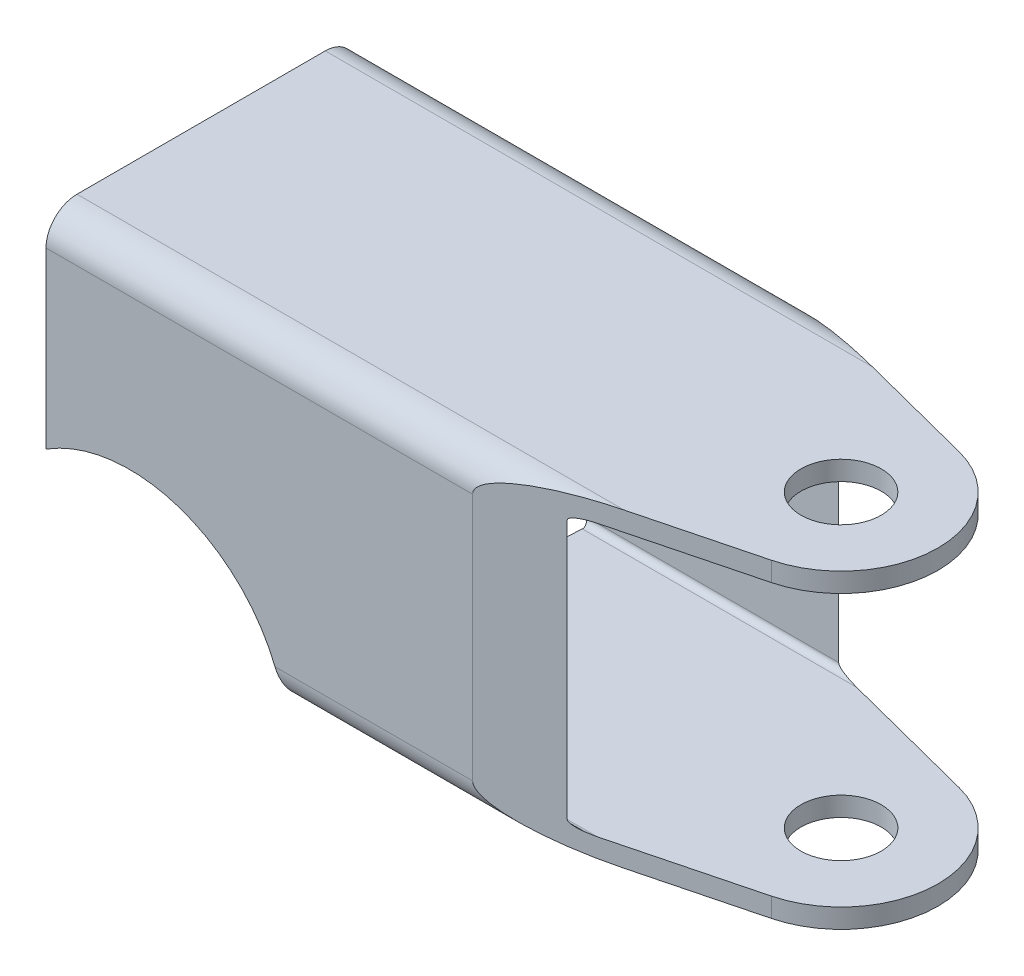
ISO-10303-21;
HEADER;
FILE_DESCRIPTION(('STEP AP214'),'2;1');
FILE_NAME('part.step','',(''),(''),'','','');
FILE_SCHEMA(('AUTOMOTIVE_DESIGN { 1 0 10303 214 1 1 1 1 }'));
ENDSEC;
DATA;
#1=APPLICATION_CONTEXT('core data for automotive mechanical design processes');
#2=APPLICATION_PROTOCOL_DEFINITION('international standard','automotive_design',2000,#1);
#3=PRODUCT_CONTEXT('',#1,'mechanical');
#4=PRODUCT('Part','Part','',(#3));
#5=PRODUCT_RELATED_PRODUCT_CATEGORY('part','',(#4));
#6=PRODUCT_DEFINITION_FORMATION('','',#4);
#7=PRODUCT_DEFINITION_CONTEXT('part definition',#1,'design');
#8=PRODUCT_DEFINITION('design','',#6,#7);
#9=PRODUCT_DEFINITION_SHAPE('','',#8);
#10=(LENGTH_UNIT() NAMED_UNIT(*) SI_UNIT(.MILLI.,.METRE.));
#11=(NAMED_UNIT(*) PLANE_ANGLE_UNIT() SI_UNIT($,.RADIAN.));
#12=(NAMED_UNIT(*) SI_UNIT($,.STERADIAN.) SOLID_ANGLE_UNIT());
#13=UNCERTAINTY_MEASURE_WITH_UNIT(LENGTH_MEASURE(1.E-05),#10,'distance_accuracy_value','');
#14=(GEOMETRIC_REPRESENTATION_CONTEXT(3) GLOBAL_UNCERTAINTY_ASSIGNED_CONTEXT((#13)) GLOBAL_UNIT_ASSIGNED_CONTEXT((#10,
#11,#12)) REPRESENTATION_CONTEXT('',''));
#15=CARTESIAN_POINT('',(0.,0.,0.));
#16=DIRECTION('',(0.,0.,1.));
#17=DIRECTION('',(1.,0.,0.));
#18=AXIS2_PLACEMENT_3D('',#15,#16,#17);
#19=CARTESIAN_POINT('',(-34.925,-10.16,-10.16));
#20=DIRECTION('',(1.,0.,0.));
#21=DIRECTION('',(0.,0.,-1.));
#22=AXIS2_PLACEMENT_3D('',#19,#20,#21);
#23=CYLINDRICAL_SURFACE('',#22,2.54);
#24=DIRECTION('',(1.,0.,0.));
#25=VECTOR('',#24,1.);
#26=CARTESIAN_POINT('',(-34.925,-12.7,-10.16));
#27=LINE('',#26,#25);
#28=CARTESIAN_POINT('',(-13.7182264424956,-12.7,-10.16));
#29=VERTEX_POINT('',#28);
#30=CARTESIAN_POINT('',(9.85035141375775,-12.7,-10.16));
#31=VERTEX_POINT('',#30);
#32=EDGE_CURVE('E271',#29,#31,#27,.T.);
#33=ORIENTED_EDGE('',*,*,#32,.F.);
#34=CARTESIAN_POINT('',(-13.7182264424956,-12.7,-10.16));
#35=CARTESIAN_POINT('',(-13.7135331066493,-12.7000078260514,-10.2270607320792));
#36=CARTESIAN_POINT('',(-13.7096981860365,-12.6973442224428,-10.2941815765864));
#37=CARTESIAN_POINT('',(-13.7038185741869,-12.6867039159123,-10.4280825797596));
#38=CARTESIAN_POINT('',(-13.7017739686565,-12.6787269586599,-10.4948627219632));
#39=CARTESIAN_POINT('',(-13.6995495263266,-12.6574961715554,-10.6275745089524));
#40=CARTESIAN_POINT('',(-13.6993685555218,-12.6442455557774,-10.6935066453425));
#41=CARTESIAN_POINT('',(-13.7009456608916,-12.6125757210065,-10.8240724461871));
#42=CARTESIAN_POINT('',(-13.7027036549143,-12.5941567210175,-10.888706165536));
#43=CARTESIAN_POINT('',(-13.7110181815574,-12.5312885732716,-11.0800995297721));
#44=CARTESIAN_POINT('',(-13.7206154768665,-12.4792301167068,-11.204339958067));
#45=CARTESIAN_POINT('',(-13.7484969409115,-12.3567057952759,-11.4421859547083));
#46=CARTESIAN_POINT('',(-13.7667782508367,-12.2862459916376,-11.5557950082215));
#47=CARTESIAN_POINT('',(-13.8122681170207,-12.129974471012,-11.7687646531887));
#48=CARTESIAN_POINT('',(-13.8394192065768,-12.0442631534738,-11.8682111994497));
#49=CARTESIAN_POINT('',(-13.9027116578483,-11.8603508844657,-12.0513640805131));
#50=CARTESIAN_POINT('',(-13.9388515948315,-11.7621519134929,-12.1350729060555));
#51=CARTESIAN_POINT('',(-14.0208576882824,-11.5539288451304,-12.2873546071633));
#52=CARTESIAN_POINT('',(-14.0669572721923,-11.4436594432852,-12.3554649313777));
#53=CARTESIAN_POINT('',(-14.1675446833261,-11.2170527097297,-12.4731342681246));
#54=CARTESIAN_POINT('',(-14.2220462156292,-11.1007056730807,-12.5226625083965));
#55=CARTESIAN_POINT('',(-14.3476528714058,-10.8464837616858,-12.6097218171404));
#56=CARTESIAN_POINT('',(-14.420019675973,-10.7081362661932,-12.6440772371934));
#57=CARTESIAN_POINT('',(-14.5342508197065,-10.5013899544232,-12.6779229900785));
#58=CARTESIAN_POINT('',(-14.5732298433072,-10.4326769675594,-12.6862575172008));
#59=CARTESIAN_POINT('',(-14.6528529003152,-10.2958347476473,-12.6972904687981));
#60=CARTESIAN_POINT('',(-14.6934955891723,-10.2277050949788,-12.6999933564374));
#61=CARTESIAN_POINT('',(-14.7348774750506,-10.16,-12.7));
#62=B_SPLINE_CURVE_WITH_KNOTS('',3,(#34,#35,#36,#37,#38,#39,#40,#41,#42,#43,#44,#45,#46,#47,#48,
#49,#50,#51,#52,#53,#54,#55,#56,#57,#58,#59,#60,#61),.UNSPECIFIED.,.F.,.F.,(4,2,2,2,2,2,2,2,2,2,
2,2,2,4),(0.,0.201614971076089,0.403239593403117,0.604741521677042,0.80623491284372,
1.2092559696235,1.61214444218968,2.01247274577166,2.41273763771481,2.82366400049971,
3.23526789204322,3.71255352894807,3.95068599902263,4.18862967341562),.UNSPECIFIED.);
#63=CARTESIAN_POINT('',(-14.7348774750506,-10.16,-12.7));
#64=VERTEX_POINT('',#63);
#65=EDGE_CURVE('E453',#29,#64,#62,.T.);
#66=ORIENTED_EDGE('',*,*,#65,.T.);
#67=DIRECTION('',(1.,0.,0.));
#68=VECTOR('',#67,1.);
#69=CARTESIAN_POINT('',(-34.925,-10.16,-12.7));
#70=LINE('',#69,#68);
#71=CARTESIAN_POINT('',(0.,-10.16,-12.7));
#72=VERTEX_POINT('',#71);
#73=EDGE_CURVE('E268',#64,#72,#70,.T.);
#74=ORIENTED_EDGE('',*,*,#73,.T.);
#75=CARTESIAN_POINT('',(9.85035141375777,-10.16,-10.16));
#76=DIRECTION('',(0.249691270948044,0.,-0.968325497553561));
#77=DIRECTION('',(0.968325497553561,0.,0.249691270948044));
#78=AXIS2_PLACEMENT_3D('',#75,#76,#77);
#79=ELLIPSE('',#78,10.1725622620125,2.54);
#80=EDGE_CURVE('E387',#72,#31,#79,.F.);
#81=ORIENTED_EDGE('',*,*,#80,.T.);
#82=EDGE_LOOP('',(#33,#66,#74,#81));
#83=FACE_BOUND('',#82,.T.);
#84=ADVANCED_FACE('F47',(#83),#23,.T.);
#85=CARTESIAN_POINT('',(-34.925,-10.6045,-10.6045));
#86=DIRECTION('',(1.,0.,0.));
#87=DIRECTION('',(0.,0.,-1.));
#88=AXIS2_PLACEMENT_3D('',#85,#86,#87);
#89=CYLINDRICAL_SURFACE('',#88,0.508);
#90=CARTESIAN_POINT('',(-14.3275972837842,-11.1125,-10.6045));
#91=CARTESIAN_POINT('',(-14.3260716351868,-11.1125324828204,-10.6304648753072));
#92=CARTESIAN_POINT('',(-14.3255319185996,-11.1105111907238,-10.656477015326));
#93=CARTESIAN_POINT('',(-14.3264030196797,-11.102553845109,-10.7077951794553));
#94=CARTESIAN_POINT('',(-14.3278088250002,-11.0966278720012,-10.733102847369));
#95=CARTESIAN_POINT('',(-14.3325425454827,-11.0810504705438,-10.7823580307866));
#96=CARTESIAN_POINT('',(-14.3358708923101,-11.071398205697,-10.8063052395019));
#97=CARTESIAN_POINT('',(-14.3443386115897,-11.0487488787507,-10.8522133813842));
#98=CARTESIAN_POINT('',(-14.3494784590142,-11.0357509396624,-10.8741737917165));
#99=CARTESIAN_POINT('',(-14.3615342024854,-11.0065749850243,-10.9160526743468));
#100=CARTESIAN_POINT('',(-14.3684856595079,-10.9903350245614,-10.9359175695541));
#101=CARTESIAN_POINT('',(-14.3838947066688,-10.9554189319011,-10.9726891826809));
#102=CARTESIAN_POINT('',(-14.3923524973503,-10.9367424754138,-10.9895955061211));
#103=CARTESIAN_POINT('',(-14.4113057834747,-10.8958699851422,-11.0215065981073));
#104=CARTESIAN_POINT('',(-14.4219123852801,-10.8735103299834,-11.0362352558856));
#105=CARTESIAN_POINT('',(-14.4443432570408,-10.827223046637,-11.0618397069566));
#106=CARTESIAN_POINT('',(-14.4561691141732,-10.803293389795,-11.0727103942482));
#107=CARTESIAN_POINT('',(-14.4827355802713,-10.7505374754692,-11.0919909824065));
#108=CARTESIAN_POINT('',(-14.4976384820446,-10.7215445395319,-11.0997199695798));
#109=CARTESIAN_POINT('',(-14.5282439181554,-10.6631461956799,-11.1099741692677));
#110=CARTESIAN_POINT('',(-14.5439445233611,-10.6337418968308,-11.1125113758807));
#111=CARTESIAN_POINT('',(-14.5598524932251,-10.6045,-11.1125));
#112=B_SPLINE_CURVE_WITH_KNOTS('',3,(#90,#91,#92,#93,#94,#95,#96,#97,#98,#99,#100,#101,#102,
#103,#104,#105,#106,#107,#108,#109,#110,#111),.UNSPECIFIED.,.F.,.F.,(4,2,2,2,2,2,2,2,2,2,4),(0.,
0.0779154702594307,0.15563057621397,0.233363138207534,0.311116096724879,0.39052834144927,
0.469951166495954,0.555996646337672,0.642155585862547,0.742228684869778,0.842070331891084),.UNSPECIFIED.);
#113=CARTESIAN_POINT('',(-14.3275972837842,-11.1125,-10.6045));
#114=VERTEX_POINT('',#113);
#115=CARTESIAN_POINT('',(-14.5598524932251,-10.6045,-11.1125));
#116=VERTEX_POINT('',#115);
#117=EDGE_CURVE('E424',#114,#116,#112,.T.);
#118=ORIENTED_EDGE('',*,*,#117,.F.);
#119=DIRECTION('',(1.,0.,0.));
#120=VECTOR('',#119,1.);
#121=CARTESIAN_POINT('',(-34.925,-11.1125,-10.6045));
#122=LINE('',#121,#120);
#123=CARTESIAN_POINT('',(8.12653991635014,-11.1125,-10.6045));
#124=VERTEX_POINT('',#123);
#125=EDGE_CURVE('E220',#114,#124,#122,.T.);
#126=ORIENTED_EDGE('',*,*,#125,.T.);
#127=CARTESIAN_POINT('',(8.12653991635013,-10.6045,-10.6045));
#128=DIRECTION('',(0.249691270948044,0.,-0.968325497553561));
#129=DIRECTION('',(0.968325497553561,0.,0.249691270948044));
#130=AXIS2_PLACEMENT_3D('',#127,#128,#129);
#131=ELLIPSE('',#130,2.03451245240249,0.508);
#132=CARTESIAN_POINT('',(6.15646963359857,-10.6045,-11.1125));
#133=VERTEX_POINT('',#132);
#134=EDGE_CURVE('E380',#133,#124,#131,.F.);
#135=ORIENTED_EDGE('',*,*,#134,.F.);
#136=DIRECTION('',(1.,0.,0.));
#137=VECTOR('',#136,1.);
#138=CARTESIAN_POINT('',(-34.925,-10.6045,-11.1125));
#139=LINE('',#138,#137);
#140=EDGE_CURVE('E415',#116,#133,#139,.T.);
#141=ORIENTED_EDGE('',*,*,#140,.F.);
#142=EDGE_LOOP('',(#118,#126,#135,#141));
#143=FACE_BOUND('',#142,.T.);
#144=ADVANCED_FACE('F422',(#143),#89,.F.);
#145=CARTESIAN_POINT('',(-34.925,-10.16,10.16));
#146=DIRECTION('',(1.,0.,0.));
#147=DIRECTION('',(0.,0.,-1.));
#148=AXIS2_PLACEMENT_3D('',#145,#146,#147);
#149=CYLINDRICAL_SURFACE('',#148,2.54);
#150=DIRECTION('',(1.,0.,0.));
#151=VECTOR('',#150,1.);
#152=CARTESIAN_POINT('',(-34.925,-10.16,12.7));
#153=LINE('',#152,#151);
#154=CARTESIAN_POINT('',(-16.17642013582,-10.16,12.7));
#155=VERTEX_POINT('',#154);
#156=CARTESIAN_POINT('',(0.,-10.16,12.7));
#157=VERTEX_POINT('',#156);
#158=EDGE_CURVE('E277',#155,#157,#153,.T.);
#159=ORIENTED_EDGE('',*,*,#158,.F.);
#160=CARTESIAN_POINT('',(-16.17642013582,-10.16,12.7));
#161=CARTESIAN_POINT('',(-16.1469849555724,-10.2327862290873,12.7000059631124));
#162=CARTESIAN_POINT('',(-16.1180556564797,-10.3057826392075,12.6968710272946));
#163=CARTESIAN_POINT('',(-16.0613229502146,-10.4516840780951,12.6842575888567));
#164=CARTESIAN_POINT('',(-16.0335198184222,-10.5245890803375,12.6747775444906));
#165=CARTESIAN_POINT('',(-15.9791359892759,-10.6698455699023,12.6493971173069));
#166=CARTESIAN_POINT('',(-15.9525567705912,-10.7421963039814,12.6334891841909));
#167=CARTESIAN_POINT('',(-15.9007555067477,-10.88565154713,12.5952717589409));
#168=CARTESIAN_POINT('',(-15.8755333351635,-10.9567561718719,12.5729628643639));
#169=CARTESIAN_POINT('',(-15.8019034472079,-11.1676219970665,12.496371388283));
#170=CARTESIAN_POINT('',(-15.7555937079619,-11.3047695909426,12.4324525255431));
#171=CARTESIAN_POINT('',(-15.6689735070256,-11.5666923381634,12.2803190371837));
#172=CARTESIAN_POINT('',(-15.6286569856877,-11.6914799452911,12.1921292124423));
#173=CARTESIAN_POINT('',(-15.5553163592825,-11.9194850497141,11.9977529297807));
#174=CARTESIAN_POINT('',(-15.5220636248658,-12.0233697900504,11.8924363478733));
#175=CARTESIAN_POINT('',(-15.4605806583773,-12.211879702922,11.6644172794983));
#176=CARTESIAN_POINT('',(-15.4323521949621,-12.2964980961845,11.5417086978529));
#177=CARTESIAN_POINT('',(-15.3814394153434,-12.4410227500795,11.286663179016));
#178=CARTESIAN_POINT('',(-15.3586107162762,-12.5016119315408,11.1547410189458));
#179=CARTESIAN_POINT('',(-15.3172835269739,-12.5995243586614,10.8819814078797));
#180=CARTESIAN_POINT('',(-15.2987797129742,-12.6368763036229,10.7411551917799));
#181=CARTESIAN_POINT('',(-15.2742855814687,-12.6745916701514,10.5258277535928));
#182=CARTESIAN_POINT('',(-15.2666355380547,-12.6841122511098,10.4530086257443));
#183=CARTESIAN_POINT('',(-15.2525246310957,-12.6968115154662,10.3068216355258));
#184=CARTESIAN_POINT('',(-15.2460619220327,-12.7000001178852,10.2334548124012));
#185=CARTESIAN_POINT('',(-15.2402074993345,-12.7,10.16));
#186=B_SPLINE_CURVE_WITH_KNOTS('',3,(#160,#161,#162,#163,#164,#165,#166,#167,#168,#169,#170,
#171,#172,#173,#174,#175,#176,#177,#178,#179,#180,#181,#182,#183,#184,#185),.UNSPECIFIED.,.F.,
.F.,(4,2,2,2,2,2,2,2,2,2,2,2,4),(0.,0.235480490323073,0.471018218904087,0.706833421791696,
0.942626617487616,1.41474259896611,1.88637793639788,2.33898038366404,2.79174184342461,
3.23051040798275,3.66873598707974,3.88999780817969,4.11091274917072),.UNSPECIFIED.);
#187=CARTESIAN_POINT('',(-15.2402074993345,-12.7,10.16));
#188=VERTEX_POINT('',#187);
#189=EDGE_CURVE('E527',#155,#188,#186,.T.);
#190=ORIENTED_EDGE('',*,*,#189,.T.);
#191=DIRECTION('',(1.,0.,0.));
#192=VECTOR('',#191,1.);
#193=CARTESIAN_POINT('',(-34.925,-12.7,10.16));
#194=LINE('',#193,#192);
#195=CARTESIAN_POINT('',(9.85035141375782,-12.7,10.16));
#196=VERTEX_POINT('',#195);
#197=EDGE_CURVE('E274',#188,#196,#194,.T.);
#198=ORIENTED_EDGE('',*,*,#197,.T.);
#199=CARTESIAN_POINT('',(9.8503514137578,-10.16,10.16));
#200=DIRECTION('',(-0.249691270948044,0.,-0.96832549755356));
#201=DIRECTION('',(0.96832549755356,0.,-0.249691270948044));
#202=AXIS2_PLACEMENT_3D('',#199,#200,#201);
#203=ELLIPSE('',#202,10.1725622620125,2.54);
#204=EDGE_CURVE('E367',#157,#196,#203,.F.);
#205=ORIENTED_EDGE('',*,*,#204,.F.);
#206=EDGE_LOOP('',(#159,#190,#198,#205));
#207=FACE_BOUND('',#206,.T.);
#208=ADVANCED_FACE('F537',(#207),#149,.T.);
#209=CARTESIAN_POINT('',(-34.925,-10.6045,10.6045));
#210=DIRECTION('',(1.,0.,0.));
#211=DIRECTION('',(0.,0.,-1.));
#212=AXIS2_PLACEMENT_3D('',#209,#210,#211);
#213=CYLINDRICAL_SURFACE('',#212,0.508000000000001);
#214=CARTESIAN_POINT('',(-15.9001158973204,-10.6045,11.1125));
#215=CARTESIAN_POINT('',(-15.8888485429124,-10.6347136866233,11.1125181450119));
#216=CARTESIAN_POINT('',(-15.8775439281474,-10.6649142880484,11.1098053255676));
#217=CARTESIAN_POINT('',(-15.8551321543317,-10.7244559014652,11.0990559587601));
#218=CARTESIAN_POINT('',(-15.844025157431,-10.7537962193059,11.0910152294678));
#219=CARTESIAN_POINT('',(-15.8222888500498,-10.8107607568219,11.0697385410354));
#220=CARTESIAN_POINT('',(-15.8116600042141,-10.8383833168166,11.056497645183));
#221=CARTESIAN_POINT('',(-15.7911653632566,-10.8909921641611,11.0251221804602));
#222=CARTESIAN_POINT('',(-15.7812990914434,-10.9159801020519,11.0069907010909));
#223=CARTESIAN_POINT('',(-15.762822597884,-10.9618800850292,10.966785508706));
#224=CARTESIAN_POINT('',(-15.7541869030355,-10.98287929408,10.9448232063754));
#225=CARTESIAN_POINT('',(-15.7381170809213,-11.0207991940598,10.8972187355369));
#226=CARTESIAN_POINT('',(-15.730683150164,-11.0377192181964,10.8715759665033));
#227=CARTESIAN_POINT('',(-15.7175890565059,-11.0660362721156,10.8187461019474));
#228=CARTESIAN_POINT('',(-15.7118581365099,-11.077669585767,10.7917029580569));
#229=CARTESIAN_POINT('',(-15.7018724817668,-11.0961201102241,10.7357885693314));
#230=CARTESIAN_POINT('',(-15.6976151126367,-11.1029459386056,10.7069206971659));
#231=CARTESIAN_POINT('',(-15.6927497386882,-11.1089687885241,10.6655355775162));
#232=CARTESIAN_POINT('',(-15.6914670966295,-11.110291783719,10.6533750532954));
#233=CARTESIAN_POINT('',(-15.6891867291583,-11.1120565072621,10.6289818993806));
#234=CARTESIAN_POINT('',(-15.6881885867625,-11.1124995311084,10.6167494023155));
#235=CARTESIAN_POINT('',(-15.6873348612126,-11.1125000000001,10.6045));
#236=B_SPLINE_CURVE_WITH_KNOTS('',3,(#214,#215,#216,#217,#218,#219,#220,#221,#222,#223,#224,
#225,#226,#227,#228,#229,#230,#231,#232,#233,#234,#235),.UNSPECIFIED.,.F.,.F.,(4,2,2,2,2,2,2,2,
2,2,4),(0.,0.0966279934074669,0.193331921069645,0.290127876163461,0.386862825521726,
0.481149059094034,0.575450694465512,0.664977159725055,0.7543427345753,0.791212195879211,
0.828027337441512),.UNSPECIFIED.);
#237=CARTESIAN_POINT('',(-15.9001158973204,-10.6045,11.1125));
#238=VERTEX_POINT('',#237);
#239=CARTESIAN_POINT('',(-15.6873348612127,-11.1125,10.6045));
#240=VERTEX_POINT('',#239);
#241=EDGE_CURVE('E196',#238,#240,#236,.T.);
#242=ORIENTED_EDGE('',*,*,#241,.F.);
#243=DIRECTION('',(1.,0.,0.));
#244=VECTOR('',#243,1.);
#245=CARTESIAN_POINT('',(-34.925,-10.6045,11.1125));
#246=LINE('',#245,#244);
#247=CARTESIAN_POINT('',(6.15646963359864,-10.6045,11.1125));
#248=VERTEX_POINT('',#247);
#249=EDGE_CURVE('E206',#238,#248,#246,.T.);
#250=ORIENTED_EDGE('',*,*,#249,.T.);
#251=CARTESIAN_POINT('',(8.12653991635019,-10.6045,10.6045));
#252=DIRECTION('',(-0.249691270948044,0.,-0.96832549755356));
#253=DIRECTION('',(0.968325497553561,0.,-0.249691270948044));
#254=AXIS2_PLACEMENT_3D('',#251,#252,#253);
#255=ELLIPSE('',#254,2.03451245240249,0.508000000000001);
#256=CARTESIAN_POINT('',(8.12653991635018,-11.1125,10.6045));
#257=VERTEX_POINT('',#256);
#258=EDGE_CURVE('E360',#248,#257,#255,.F.);
#259=ORIENTED_EDGE('',*,*,#258,.T.);
#260=DIRECTION('',(1.,0.,0.));
#261=VECTOR('',#260,1.);
#262=CARTESIAN_POINT('',(-34.925,-11.1125,10.6045));
#263=LINE('',#262,#261);
#264=EDGE_CURVE('E208',#240,#257,#263,.T.);
#265=ORIENTED_EDGE('',*,*,#264,.F.);
#266=EDGE_LOOP('',(#242,#250,#259,#265));
#267=FACE_BOUND('',#266,.T.);
#268=ADVANCED_FACE('F204',(#267),#213,.F.);
#269=CARTESIAN_POINT('',(-34.925,12.7,10.16));
#270=DIRECTION('',(0.,1.,0.));
#271=DIRECTION('',(0.,0.,1.));
#272=AXIS2_PLACEMENT_3D('',#269,#270,#271);
#273=PLANE('',#272);
#274=CARTESIAN_POINT('',(17.4625,12.7,0.));
#275=DIRECTION('',(0.,1.,0.));
#276=DIRECTION('',(0.,0.,1.));
#277=AXIS2_PLACEMENT_3D('',#274,#275,#276);
#278=CIRCLE('',#277,3.2893);
#279=CARTESIAN_POINT('',(17.4625,12.7,3.2893));
#280=VERTEX_POINT('',#279);
#281=EDGE_CURVE('E303',#280,#280,#278,.T.);
#282=ORIENTED_EDGE('',*,*,#281,.F.);
#283=EDGE_LOOP('',(#282));
#284=FACE_BOUND('',#283,.T.);
#285=CARTESIAN_POINT('',(17.4625,12.7,0.));
#286=DIRECTION('',(0.,1.,0.));
#287=DIRECTION('',(0.,0.,1.));
#288=AXIS2_PLACEMENT_3D('',#285,#286,#287);
#289=CIRCLE('',#288,7.9375);
#290=CARTESIAN_POINT('',(19.4444244631501,12.7,7.68608363683138));
#291=VERTEX_POINT('',#290);
#292=CARTESIAN_POINT('',(19.4444244631501,12.7,-7.68608363683139));
#293=VERTEX_POINT('',#292);
#294=EDGE_CURVE('E331',#291,#293,#289,.T.);
#295=ORIENTED_EDGE('',*,*,#294,.T.);
#296=DIRECTION('',(-0.968325497553561,0.,-0.249691270948044));
#297=VECTOR('',#296,1.);
#298=CARTESIAN_POINT('',(3.07063678702942,12.7,-11.9082092189968));
#299=LINE('',#298,#297);
#300=CARTESIAN_POINT('',(9.85035141375773,12.7,-10.16));
#301=VERTEX_POINT('',#300);
#302=EDGE_CURVE('E300',#293,#301,#299,.T.);
#303=ORIENTED_EDGE('',*,*,#302,.T.);
#304=DIRECTION('',(1.,0.,0.));
#305=VECTOR('',#304,1.);
#306=CARTESIAN_POINT('',(-34.925,12.7,-10.16));
#307=LINE('',#306,#305);
#308=CARTESIAN_POINT('',(-34.925,12.7,-10.16));
#309=VERTEX_POINT('',#308);
#310=EDGE_CURVE('E260',#309,#301,#307,.T.);
#311=ORIENTED_EDGE('',*,*,#310,.F.);
#312=DIRECTION('',(0.,0.,1.));
#313=VECTOR('',#312,1.);
#314=CARTESIAN_POINT('',(-34.925,12.7,10.16));
#315=LINE('',#314,#313);
#316=CARTESIAN_POINT('',(-34.925,12.7,10.16));
#317=VERTEX_POINT('',#316);
#318=EDGE_CURVE('E250',#309,#317,#315,.T.);
#319=ORIENTED_EDGE('',*,*,#318,.T.);
#320=DIRECTION('',(1.,0.,0.));
#321=VECTOR('',#320,1.);
#322=CARTESIAN_POINT('',(-34.925,12.7,10.16));
#323=LINE('',#322,#321);
#324=CARTESIAN_POINT('',(9.85035141375776,12.7,10.16));
#325=VERTEX_POINT('',#324);
#326=EDGE_CURVE('E255',#317,#325,#323,.T.);
#327=ORIENTED_EDGE('',*,*,#326,.T.);
#328=DIRECTION('',(-0.96832549755356,0.,0.249691270948044));
#329=VECTOR('',#328,1.);
#330=CARTESIAN_POINT('',(3.07063678702943,12.7,11.9082092189969));
#331=LINE('',#330,#329);
#332=EDGE_CURVE('E320',#291,#325,#331,.T.);
#333=ORIENTED_EDGE('',*,*,#332,.F.);
#334=EDGE_LOOP('',(#295,#303,#311,#319,#327,#333));
#335=FACE_BOUND('',#334,.T.);
#336=ADVANCED_FACE('F464',(#284,#335),#273,.T.);
#337=CARTESIAN_POINT('',(-34.925,10.16,-10.16));
#338=DIRECTION('',(1.,0.,0.));
#339=DIRECTION('',(0.,0.,-1.));
#340=AXIS2_PLACEMENT_3D('',#337,#338,#339);
#341=CYLINDRICAL_SURFACE('',#340,2.54);
#342=ORIENTED_EDGE('',*,*,#310,.T.);
#343=CARTESIAN_POINT('',(9.85035141375777,10.16,-10.16));
#344=DIRECTION('',(0.249691270948044,0.,-0.968325497553561));
#345=DIRECTION('',(0.968325497553561,0.,0.249691270948044));
#346=AXIS2_PLACEMENT_3D('',#343,#344,#345);
#347=ELLIPSE('',#346,10.1725622620125,2.54);
#348=CARTESIAN_POINT('',(0.,10.16,-12.7));
#349=VERTEX_POINT('',#348);
#350=EDGE_CURVE('E391',#301,#349,#347,.F.);
#351=ORIENTED_EDGE('',*,*,#350,.T.);
#352=DIRECTION('',(1.,0.,0.));
#353=VECTOR('',#352,1.);
#354=CARTESIAN_POINT('',(-34.925,10.16,-12.7));
#355=LINE('',#354,#353);
#356=CARTESIAN_POINT('',(-34.925,10.16,-12.7));
#357=VERTEX_POINT('',#356);
#358=EDGE_CURVE('E264',#357,#349,#355,.T.);
#359=ORIENTED_EDGE('',*,*,#358,.F.);
#360=CARTESIAN_POINT('',(-34.925,10.16,-10.16));
#361=DIRECTION('',(1.,0.,0.));
#362=DIRECTION('',(0.,0.,1.));
#363=AXIS2_PLACEMENT_3D('',#360,#361,#362);
#364=CIRCLE('',#363,2.54);
#365=EDGE_CURVE('E246',#357,#309,#364,.T.);
#366=ORIENTED_EDGE('',*,*,#365,.T.);
#367=EDGE_LOOP('',(#342,#351,#359,#366));
#368=FACE_BOUND('',#367,.T.);
#369=ADVANCED_FACE('F460',(#368),#341,.T.);
#370=CARTESIAN_POINT('',(-34.925,10.16,-12.7));
#371=DIRECTION('',(0.,0.,-1.));
#372=DIRECTION('',(-1.,0.,0.));
#373=AXIS2_PLACEMENT_3D('',#370,#371,#372);
#374=PLANE('',#373);
#375=ORIENTED_EDGE('',*,*,#73,.F.);
#376=CARTESIAN_POINT('',(-25.6115189092878,-16.7381117260752,-12.7));
#377=DIRECTION('',(0.,0.,-1.));
#378=DIRECTION('',(0.785558617287698,-0.618787248418259,0.));
#379=AXIS2_PLACEMENT_3D('',#376,#377,#378);
#380=ELLIPSE('',#379,12.7907116781382,12.7);
#381=CARTESIAN_POINT('',(-34.925,-7.97208127526222,-12.7));
#382=VERTEX_POINT('',#381);
#383=EDGE_CURVE('E312',#64,#382,#380,.F.);
#384=ORIENTED_EDGE('',*,*,#383,.T.);
#385=DIRECTION('',(0.,1.,0.));
#386=VECTOR('',#385,1.);
#387=CARTESIAN_POINT('',(-34.925,10.16,-12.7));
#388=LINE('',#387,#386);
#389=EDGE_CURVE('E243',#382,#357,#388,.T.);
#390=ORIENTED_EDGE('',*,*,#389,.T.);
#391=ORIENTED_EDGE('',*,*,#358,.T.);
#392=DIRECTION('',(0.,1.,0.));
#393=VECTOR('',#392,1.);
#394=CARTESIAN_POINT('',(0.,-12.7,-12.7));
#395=LINE('',#394,#393);
#396=EDGE_CURVE('E336',#72,#349,#395,.T.);
#397=ORIENTED_EDGE('',*,*,#396,.F.);
#398=EDGE_LOOP('',(#375,#384,#390,#391,#397));
#399=FACE_BOUND('',#398,.T.);
#400=ADVANCED_FACE('F456',(#399),#374,.T.);
#401=CARTESIAN_POINT('',(-34.925,-12.7,10.16));
#402=DIRECTION('',(0.,-1.,0.));
#403=DIRECTION('',(0.,0.,-1.));
#404=AXIS2_PLACEMENT_3D('',#401,#402,#403);
#405=PLANE('',#404);
#406=CARTESIAN_POINT('',(17.4625,-12.7,0.));
#407=DIRECTION('',(0.,1.,0.));
#408=DIRECTION('',(0.,0.,1.));
#409=AXIS2_PLACEMENT_3D('',#406,#407,#408);
#410=CIRCLE('',#409,3.2893);
#411=CARTESIAN_POINT('',(17.4625,-12.7,3.2893));
#412=VERTEX_POINT('',#411);
#413=EDGE_CURVE('E294',#412,#412,#410,.T.);
#414=ORIENTED_EDGE('',*,*,#413,.T.);
#415=EDGE_LOOP('',(#414));
#416=FACE_BOUND('',#415,.T.);
#417=ORIENTED_EDGE('',*,*,#197,.F.);
#418=CARTESIAN_POINT('',(-30.7379552928714,-12.7,41.8027122990011));
#419=DIRECTION('',(0.,-1.,0.));
#420=DIRECTION('',(0.0936450462681984,0.,-0.995605647487713));
#421=AXIS2_PLACEMENT_3D('',#418,#419,#420);
#422=ELLIPSE('',#421,172.63724383639,12.7);
#423=EDGE_CURVE('E489',#188,#29,#422,.F.);
#424=ORIENTED_EDGE('',*,*,#423,.T.);
#425=ORIENTED_EDGE('',*,*,#32,.T.);
#426=DIRECTION('',(-0.968325497553561,0.,-0.249691270948044));
#427=VECTOR('',#426,1.);
#428=CARTESIAN_POINT('',(3.07063678702942,-12.7,-11.9082092189968));
#429=LINE('',#428,#427);
#430=CARTESIAN_POINT('',(19.4444244631501,-12.7,-7.68608363683138));
#431=VERTEX_POINT('',#430);
#432=EDGE_CURVE('E315',#431,#31,#429,.T.);
#433=ORIENTED_EDGE('',*,*,#432,.F.);
#434=CARTESIAN_POINT('',(17.4625,-12.7,0.));
#435=DIRECTION('',(0.,1.,0.));
#436=DIRECTION('',(0.,0.,1.));
#437=AXIS2_PLACEMENT_3D('',#434,#435,#436);
#438=CIRCLE('',#437,7.9375);
#439=CARTESIAN_POINT('',(19.4444244631501,-12.7,7.68608363683139));
#440=VERTEX_POINT('',#439);
#441=EDGE_CURVE('E319',#440,#431,#438,.T.);
#442=ORIENTED_EDGE('',*,*,#441,.F.);
#443=DIRECTION('',(-0.96832549755356,0.,0.249691270948044));
#444=VECTOR('',#443,1.);
#445=CARTESIAN_POINT('',(3.07063678702943,-12.7,11.9082092189969));
#446=LINE('',#445,#444);
#447=EDGE_CURVE('E323',#440,#196,#446,.T.);
#448=ORIENTED_EDGE('',*,*,#447,.T.);
#449=EDGE_LOOP('',(#417,#424,#425,#433,#442,#448));
#450=FACE_BOUND('',#449,.T.);
#451=ADVANCED_FACE('F444',(#416,#450),#405,.T.);
#452=CARTESIAN_POINT('',(-34.925,10.6045,-10.6045));
#453=DIRECTION('',(1.,0.,0.));
#454=DIRECTION('',(0.,0.,-1.));
#455=AXIS2_PLACEMENT_3D('',#452,#453,#454);
#456=CYLINDRICAL_SURFACE('',#455,0.508000000000001);
#457=CARTESIAN_POINT('',(8.12653991635016,10.6045,-10.6045));
#458=DIRECTION('',(0.249691270948044,0.,-0.968325497553561));
#459=DIRECTION('',(0.968325497553561,0.,0.249691270948044));
#460=AXIS2_PLACEMENT_3D('',#457,#458,#459);
#461=ELLIPSE('',#460,2.0345124524025,0.508000000000001);
#462=CARTESIAN_POINT('',(8.12653991635019,11.1125,-10.6045));
#463=VERTEX_POINT('',#462);
#464=CARTESIAN_POINT('',(6.15646963359859,10.6045,-11.1125));
#465=VERTEX_POINT('',#464);
#466=EDGE_CURVE('E373',#463,#465,#461,.F.);
#467=ORIENTED_EDGE('',*,*,#466,.F.);
#468=DIRECTION('',(1.,0.,0.));
#469=VECTOR('',#468,1.);
#470=CARTESIAN_POINT('',(-34.925,11.1125,-10.6045));
#471=LINE('',#470,#469);
#472=CARTESIAN_POINT('',(-34.925,11.1125,-10.6045));
#473=VERTEX_POINT('',#472);
#474=EDGE_CURVE('E229',#473,#463,#471,.T.);
#475=ORIENTED_EDGE('',*,*,#474,.F.);
#476=CARTESIAN_POINT('',(-34.925,10.6045,-10.6045));
#477=DIRECTION('',(1.,0.,0.));
#478=DIRECTION('',(0.,0.,1.));
#479=AXIS2_PLACEMENT_3D('',#476,#477,#478);
#480=CIRCLE('',#479,0.508000000000001);
#481=CARTESIAN_POINT('',(-34.925,10.6045,-11.1125));
#482=VERTEX_POINT('',#481);
#483=EDGE_CURVE('E395',#482,#473,#480,.T.);
#484=ORIENTED_EDGE('',*,*,#483,.F.);
#485=DIRECTION('',(1.,0.,0.));
#486=VECTOR('',#485,1.);
#487=CARTESIAN_POINT('',(-34.925,10.6045,-11.1125));
#488=LINE('',#487,#486);
#489=EDGE_CURVE('E239',#482,#465,#488,.T.);
#490=ORIENTED_EDGE('',*,*,#489,.T.);
#491=EDGE_LOOP('',(#467,#475,#484,#490));
#492=FACE_BOUND('',#491,.T.);
#493=ADVANCED_FACE('F480',(#492),#456,.F.);
#494=CARTESIAN_POINT('',(-34.925,10.6045,-11.1125));
#495=DIRECTION('',(0.,0.,-1.));
#496=DIRECTION('',(0.,1.,0.));
#497=AXIS2_PLACEMENT_3D('',#494,#495,#496);
#498=PLANE('',#497);
#499=CARTESIAN_POINT('',(-25.7608365746967,-16.6204936829588,-11.1125));
#500=DIRECTION('',(0.,0.,-1.));
#501=DIRECTION('',(0.785558617287697,-0.61878724841826,0.));
#502=AXIS2_PLACEMENT_3D('',#499,#500,#501);
#503=ELLIPSE('',#502,12.7907116781382,12.7);
#504=CARTESIAN_POINT('',(-34.925,-7.69890427920705,-11.1125));
#505=VERTEX_POINT('',#504);
#506=EDGE_CURVE('E486',#116,#505,#503,.F.);
#507=ORIENTED_EDGE('',*,*,#506,.F.);
#508=ORIENTED_EDGE('',*,*,#140,.T.);
#509=DIRECTION('',(0.,-1.,0.));
#510=VECTOR('',#509,1.);
#511=CARTESIAN_POINT('',(6.1564696335986,10.6045,-11.1125));
#512=LINE('',#511,#510);
#513=EDGE_CURVE('E376',#465,#133,#512,.T.);
#514=ORIENTED_EDGE('',*,*,#513,.F.);
#515=ORIENTED_EDGE('',*,*,#489,.F.);
#516=DIRECTION('',(0.,1.,0.));
#517=VECTOR('',#516,1.);
#518=CARTESIAN_POINT('',(-34.925,10.6045,-11.1125));
#519=LINE('',#518,#517);
#520=EDGE_CURVE('E233',#505,#482,#519,.T.);
#521=ORIENTED_EDGE('',*,*,#520,.F.);
#522=EDGE_LOOP('',(#507,#508,#514,#515,#521));
#523=FACE_BOUND('',#522,.T.);
#524=ADVANCED_FACE('F484',(#523),#498,.F.);
#525=CARTESIAN_POINT('',(-34.925,-11.1125,10.6045));
#526=DIRECTION('',(0.,-1.,0.));
#527=DIRECTION('',(0.,0.,-1.));
#528=AXIS2_PLACEMENT_3D('',#525,#526,#527);
#529=PLANE('',#528);
#530=CARTESIAN_POINT('',(-32.7533075938957,-11.1125,63.2293249446988));
#531=DIRECTION('',(0.,-1.,0.));
#532=DIRECTION('',(0.0936450462681984,0.,-0.995605647487713));
#533=AXIS2_PLACEMENT_3D('',#530,#531,#532);
#534=ELLIPSE('',#533,172.63724383639,12.7);
#535=EDGE_CURVE('E494',#240,#114,#534,.F.);
#536=ORIENTED_EDGE('',*,*,#535,.F.);
#537=ORIENTED_EDGE('',*,*,#264,.T.);
#538=DIRECTION('',(0.96832549755356,0.,-0.249691270948044));
#539=VECTOR('',#538,1.);
#540=CARTESIAN_POINT('',(-32.2409202823815,-11.1125,21.0136056854654));
#541=LINE('',#540,#539);
#542=CARTESIAN_POINT('',(19.4444244631501,-11.1125,7.68608363683139));
#543=VERTEX_POINT('',#542);
#544=EDGE_CURVE('E363',#257,#543,#541,.T.);
#545=ORIENTED_EDGE('',*,*,#544,.T.);
#546=CARTESIAN_POINT('',(17.4625,-11.1125,0.));
#547=DIRECTION('',(0.,-1.,0.));
#548=DIRECTION('',(0.,0.,-1.));
#549=AXIS2_PLACEMENT_3D('',#546,#547,#548);
#550=CIRCLE('',#549,7.9375);
#551=CARTESIAN_POINT('',(19.4444244631501,-11.1125,-7.68608363683138));
#552=VERTEX_POINT('',#551);
#553=EDGE_CURVE('E339',#552,#543,#550,.T.);
#554=ORIENTED_EDGE('',*,*,#553,.F.);
#555=DIRECTION('',(0.968325497553561,0.,0.249691270948044));
#556=VECTOR('',#555,1.);
#557=CARTESIAN_POINT('',(-27.1129568480424,-11.1125,-19.6913150811901));
#558=LINE('',#557,#556);
#559=EDGE_CURVE('E384',#124,#552,#558,.T.);
#560=ORIENTED_EDGE('',*,*,#559,.F.);
#561=ORIENTED_EDGE('',*,*,#125,.F.);
#562=EDGE_LOOP('',(#536,#537,#545,#554,#560,#561));
#563=FACE_BOUND('',#562,.T.);
#564=CARTESIAN_POINT('',(17.4625,-11.1125,0.));
#565=DIRECTION('',(0.,-1.,0.));
#566=DIRECTION('',(0.,0.,-1.));
#567=AXIS2_PLACEMENT_3D('',#564,#565,#566);
#568=CIRCLE('',#567,3.2893);
#569=CARTESIAN_POINT('',(17.4625,-11.1125,-3.2893));
#570=VERTEX_POINT('',#569);
#571=EDGE_CURVE('E293',#570,#570,#568,.T.);
#572=ORIENTED_EDGE('',*,*,#571,.T.);
#573=EDGE_LOOP('',(#572));
#574=FACE_BOUND('',#573,.T.);
#575=ADVANCED_FACE('F433',(#563,#574),#529,.F.);
#576=CARTESIAN_POINT('',(-34.925,11.1125,10.6045));
#577=DIRECTION('',(0.,1.,0.));
#578=DIRECTION('',(0.,0.,1.));
#579=AXIS2_PLACEMENT_3D('',#576,#577,#578);
#580=PLANE('',#579);
#581=CARTESIAN_POINT('',(17.4625,11.1125,0.));
#582=DIRECTION('',(0.,1.,0.));
#583=DIRECTION('',(0.,0.,1.));
#584=AXIS2_PLACEMENT_3D('',#581,#582,#583);
#585=CIRCLE('',#584,3.2893);
#586=CARTESIAN_POINT('',(17.4625,11.1125,3.2893));
#587=VERTEX_POINT('',#586);
#588=EDGE_CURVE('E290',#587,#587,#585,.T.);
#589=ORIENTED_EDGE('',*,*,#588,.T.);
#590=EDGE_LOOP('',(#589));
#591=FACE_BOUND('',#590,.T.);
#592=DIRECTION('',(-0.968325497553561,0.,-0.249691270948044));
#593=VECTOR('',#592,1.);
#594=CARTESIAN_POINT('',(-27.1129568480424,11.1125,-19.6913150811901));
#595=LINE('',#594,#593);
#596=CARTESIAN_POINT('',(19.4444244631501,11.1125,-7.68608363683139));
#597=VERTEX_POINT('',#596);
#598=EDGE_CURVE('E56',#597,#463,#595,.T.);
#599=ORIENTED_EDGE('',*,*,#598,.F.);
#600=CARTESIAN_POINT('',(17.4625,11.1125,0.));
#601=DIRECTION('',(0.,1.,0.));
#602=DIRECTION('',(0.,0.,1.));
#603=AXIS2_PLACEMENT_3D('',#600,#601,#602);
#604=CIRCLE('',#603,7.9375);
#605=CARTESIAN_POINT('',(19.4444244631501,11.1125,7.68608363683138));
#606=VERTEX_POINT('',#605);
#607=EDGE_CURVE('E259',#606,#597,#604,.T.);
#608=ORIENTED_EDGE('',*,*,#607,.F.);
#609=DIRECTION('',(-0.96832549755356,0.,0.249691270948044));
#610=VECTOR('',#609,1.);
#611=CARTESIAN_POINT('',(-32.2409202823815,11.1125,21.0136056854654));
#612=LINE('',#611,#610);
#613=CARTESIAN_POINT('',(8.12653991635014,11.1125,10.6045));
#614=VERTEX_POINT('',#613);
#615=EDGE_CURVE('E285',#606,#614,#612,.T.);
#616=ORIENTED_EDGE('',*,*,#615,.T.);
#617=DIRECTION('',(1.,0.,0.));
#618=VECTOR('',#617,1.);
#619=CARTESIAN_POINT('',(-34.925,11.1125,10.6045));
#620=LINE('',#619,#618);
#621=CARTESIAN_POINT('',(-34.925,11.1125,10.6045));
#622=VERTEX_POINT('',#621);
#623=EDGE_CURVE('E222',#622,#614,#620,.T.);
#624=ORIENTED_EDGE('',*,*,#623,.F.);
#625=DIRECTION('',(0.,0.,1.));
#626=VECTOR('',#625,1.);
#627=CARTESIAN_POINT('',(-34.925,11.1125,10.6045));
#628=LINE('',#627,#626);
#629=EDGE_CURVE('E399',#473,#622,#628,.T.);
#630=ORIENTED_EDGE('',*,*,#629,.F.);
#631=ORIENTED_EDGE('',*,*,#474,.T.);
#632=EDGE_LOOP('',(#599,#608,#616,#624,#630,#631));
#633=FACE_BOUND('',#632,.T.);
#634=ADVANCED_FACE('F474',(#591,#633),#580,.F.);
#635=CARTESIAN_POINT('',(-34.925,10.16,10.16));
#636=DIRECTION('',(1.,0.,0.));
#637=DIRECTION('',(0.,0.,-1.));
#638=AXIS2_PLACEMENT_3D('',#635,#636,#637);
#639=CYLINDRICAL_SURFACE('',#638,2.54);
#640=CARTESIAN_POINT('',(9.85035141375779,10.16,10.16));
#641=DIRECTION('',(-0.249691270948044,0.,-0.96832549755356));
#642=DIRECTION('',(0.96832549755356,0.,-0.249691270948044));
#643=AXIS2_PLACEMENT_3D('',#640,#641,#642);
#644=ELLIPSE('',#643,10.1725622620125,2.54);
#645=CARTESIAN_POINT('',(0.,10.16,12.7));
#646=VERTEX_POINT('',#645);
#647=EDGE_CURVE('E70',#325,#646,#644,.F.);
#648=ORIENTED_EDGE('',*,*,#647,.F.);
#649=ORIENTED_EDGE('',*,*,#326,.F.);
#650=CARTESIAN_POINT('',(-34.925,10.16,10.16));
#651=DIRECTION('',(1.,0.,0.));
#652=DIRECTION('',(0.,0.,-1.));
#653=AXIS2_PLACEMENT_3D('',#650,#651,#652);
#654=CIRCLE('',#653,2.54);
#655=CARTESIAN_POINT('',(-34.925,10.16,12.7));
#656=VERTEX_POINT('',#655);
#657=EDGE_CURVE('E234',#317,#656,#654,.T.);
#658=ORIENTED_EDGE('',*,*,#657,.T.);
#659=DIRECTION('',(1.,0.,0.));
#660=VECTOR('',#659,1.);
#661=CARTESIAN_POINT('',(-34.925,10.16,12.7));
#662=LINE('',#661,#660);
#663=EDGE_CURVE('E254',#656,#646,#662,.T.);
#664=ORIENTED_EDGE('',*,*,#663,.T.);
#665=EDGE_LOOP('',(#648,#649,#658,#664));
#666=FACE_BOUND('',#665,.T.);
#667=ADVANCED_FACE('F49',(#666),#639,.T.);
#668=CARTESIAN_POINT('',(-34.925,10.16,12.7));
#669=DIRECTION('',(0.,0.,1.));
#670=DIRECTION('',(1.,0.,0.));
#671=AXIS2_PLACEMENT_3D('',#668,#669,#670);
#672=PLANE('',#671);
#673=DIRECTION('',(0.,-1.,0.));
#674=VECTOR('',#673,1.);
#675=CARTESIAN_POINT('',(-34.925,10.16,12.7));
#676=LINE('',#675,#674);
#677=CARTESIAN_POINT('',(-34.925,-4.11343081853669,12.7));
#678=VERTEX_POINT('',#677);
#679=EDGE_CURVE('E238',#656,#678,#676,.T.);
#680=ORIENTED_EDGE('',*,*,#679,.T.);
#681=CARTESIAN_POINT('',(-28.00060155583,-14.8562230362129,12.7));
#682=DIRECTION('',(0.,0.,1.));
#683=DIRECTION('',(0.785558617287698,-0.618787248418259,0.));
#684=AXIS2_PLACEMENT_3D('',#681,#682,#683);
#685=ELLIPSE('',#684,12.7907116781382,12.7);
#686=EDGE_CURVE('E536',#678,#155,#685,.F.);
#687=ORIENTED_EDGE('',*,*,#686,.T.);
#688=ORIENTED_EDGE('',*,*,#158,.T.);
#689=DIRECTION('',(0.,1.,0.));
#690=VECTOR('',#689,1.);
#691=CARTESIAN_POINT('',(0.,-12.7,12.7));
#692=LINE('',#691,#690);
#693=EDGE_CURVE('E340',#157,#646,#692,.T.);
#694=ORIENTED_EDGE('',*,*,#693,.T.);
#695=ORIENTED_EDGE('',*,*,#663,.F.);
#696=EDGE_LOOP('',(#680,#687,#688,#694,#695));
#697=FACE_BOUND('',#696,.T.);
#698=ADVANCED_FACE('F541',(#697),#672,.T.);
#699=CARTESIAN_POINT('',(-34.925,10.16,10.16));
#700=DIRECTION('',(1.,0.,0.));
#701=DIRECTION('',(0.,0.,-1.));
#702=AXIS2_PLACEMENT_3D('',#699,#700,#701);
#703=PLANE('',#702);
#704=CARTESIAN_POINT('',(-34.925,-9.40185035678949,86.3180980329334));
#705=DIRECTION('',(1.,0.,0.));
#706=DIRECTION('',(0.,-0.0738875862632164,-0.997266576496072));
#707=AXIS2_PLACEMENT_3D('',#704,#705,#706);
#708=ELLIPSE('',#707,135.986955953547,12.7);
#709=CARTESIAN_POINT('',(-34.925,-4.32785234317866,11.1125));
#710=VERTEX_POINT('',#709);
#711=EDGE_CURVE('E62',#678,#710,#708,.F.);
#712=ORIENTED_EDGE('',*,*,#711,.F.);
#713=ORIENTED_EDGE('',*,*,#679,.F.);
#714=ORIENTED_EDGE('',*,*,#657,.F.);
#715=ORIENTED_EDGE('',*,*,#318,.F.);
#716=ORIENTED_EDGE('',*,*,#365,.F.);
#717=ORIENTED_EDGE('',*,*,#389,.F.);
#718=EDGE_CURVE('E309',#505,#382,#708,.F.);
#719=ORIENTED_EDGE('',*,*,#718,.F.);
#720=ORIENTED_EDGE('',*,*,#520,.T.);
#721=ORIENTED_EDGE('',*,*,#483,.T.);
#722=ORIENTED_EDGE('',*,*,#629,.T.);
#723=CARTESIAN_POINT('',(-34.925,10.6045,10.6045));
#724=DIRECTION('',(1.,0.,0.));
#725=DIRECTION('',(0.,0.,-1.));
#726=AXIS2_PLACEMENT_3D('',#723,#724,#725);
#727=CIRCLE('',#726,0.507999999999997);
#728=CARTESIAN_POINT('',(-34.925,10.6045,11.1125));
#729=VERTEX_POINT('',#728);
#730=EDGE_CURVE('E403',#622,#729,#727,.T.);
#731=ORIENTED_EDGE('',*,*,#730,.T.);
#732=DIRECTION('',(0.,-1.,0.));
#733=VECTOR('',#732,1.);
#734=CARTESIAN_POINT('',(-34.925,10.6045,11.1125));
#735=LINE('',#734,#733);
#736=EDGE_CURVE('E407',#729,#710,#735,.T.);
#737=ORIENTED_EDGE('',*,*,#736,.T.);
#738=EDGE_LOOP('',(#712,#713,#714,#715,#716,#717,#719,#720,#721,#722,#731,#737));
#739=FACE_BOUND('',#738,.T.);
#740=ADVANCED_FACE('F543',(#739),#703,.F.);
#741=CARTESIAN_POINT('',(-34.925,10.6045,11.1125));
#742=DIRECTION('',(0.,0.,1.));
#743=DIRECTION('',(1.,0.,0.));
#744=AXIS2_PLACEMENT_3D('',#741,#742,#743);
#745=PLANE('',#744);
#746=CARTESIAN_POINT('',(-27.8512838904211,-14.9738410793293,11.1125));
#747=DIRECTION('',(0.,0.,1.));
#748=DIRECTION('',(0.785558617287698,-0.618787248418259,0.));
#749=AXIS2_PLACEMENT_3D('',#746,#747,#748);
#750=ELLIPSE('',#749,12.7907116781382,12.7);
#751=EDGE_CURVE('E11',#710,#238,#750,.F.);
#752=ORIENTED_EDGE('',*,*,#751,.F.);
#753=ORIENTED_EDGE('',*,*,#736,.F.);
#754=DIRECTION('',(1.,0.,0.));
#755=VECTOR('',#754,1.);
#756=CARTESIAN_POINT('',(-34.925,10.6045,11.1125));
#757=LINE('',#756,#755);
#758=CARTESIAN_POINT('',(6.1564696335986,10.6045,11.1125));
#759=VERTEX_POINT('',#758);
#760=EDGE_CURVE('E216',#729,#759,#757,.T.);
#761=ORIENTED_EDGE('',*,*,#760,.T.);
#762=DIRECTION('',(0.,-1.,0.));
#763=VECTOR('',#762,1.);
#764=CARTESIAN_POINT('',(6.15646963359863,10.6045,11.1125));
#765=LINE('',#764,#763);
#766=EDGE_CURVE('E214',#759,#248,#765,.T.);
#767=ORIENTED_EDGE('',*,*,#766,.T.);
#768=ORIENTED_EDGE('',*,*,#249,.F.);
#769=EDGE_LOOP('',(#752,#753,#761,#767,#768));
#770=FACE_BOUND('',#769,.T.);
#771=ADVANCED_FACE('F212',(#770),#745,.F.);
#772=CARTESIAN_POINT('',(-34.925,10.6045,10.6045));
#773=DIRECTION('',(1.,0.,0.));
#774=DIRECTION('',(0.,0.,-1.));
#775=AXIS2_PLACEMENT_3D('',#772,#773,#774);
#776=CYLINDRICAL_SURFACE('',#775,0.507999999999997);
#777=ORIENTED_EDGE('',*,*,#623,.T.);
#778=CARTESIAN_POINT('',(8.12653991635015,10.6045,10.6045));
#779=DIRECTION('',(-0.249691270948044,0.,-0.96832549755356));
#780=DIRECTION('',(0.968325497553561,0.,-0.249691270948044));
#781=AXIS2_PLACEMENT_3D('',#778,#779,#780);
#782=ELLIPSE('',#781,2.03451245240248,0.507999999999997);
#783=EDGE_CURVE('E354',#614,#759,#782,.F.);
#784=ORIENTED_EDGE('',*,*,#783,.T.);
#785=ORIENTED_EDGE('',*,*,#760,.F.);
#786=ORIENTED_EDGE('',*,*,#730,.F.);
#787=EDGE_LOOP('',(#777,#784,#785,#786));
#788=FACE_BOUND('',#787,.T.);
#789=ADVANCED_FACE('F569',(#788),#776,.F.);
#790=CARTESIAN_POINT('',(3.07063678702942,-12.7,-11.9082092189968));
#791=DIRECTION('',(0.249691270948044,0.,-0.968325497553561));
#792=DIRECTION('',(-0.968325497553561,0.,-0.249691270948044));
#793=AXIS2_PLACEMENT_3D('',#790,#791,#792);
#794=PLANE('',#793);
#795=ORIENTED_EDGE('',*,*,#302,.F.);
#796=DIRECTION('',(0.,1.,0.));
#797=VECTOR('',#796,1.);
#798=CARTESIAN_POINT('',(19.4444244631501,-12.7,-7.68608363683138));
#799=LINE('',#798,#797);
#800=EDGE_CURVE('E327',#597,#293,#799,.T.);
#801=ORIENTED_EDGE('',*,*,#800,.F.);
#802=ORIENTED_EDGE('',*,*,#598,.T.);
#803=ORIENTED_EDGE('',*,*,#466,.T.);
#804=ORIENTED_EDGE('',*,*,#513,.T.);
#805=ORIENTED_EDGE('',*,*,#134,.T.);
#806=ORIENTED_EDGE('',*,*,#559,.T.);
#807=EDGE_CURVE('E348',#431,#552,#799,.T.);
#808=ORIENTED_EDGE('',*,*,#807,.F.);
#809=ORIENTED_EDGE('',*,*,#432,.T.);
#810=ORIENTED_EDGE('',*,*,#80,.F.);
#811=ORIENTED_EDGE('',*,*,#396,.T.);
#812=ORIENTED_EDGE('',*,*,#350,.F.);
#813=EDGE_LOOP('',(#795,#801,#802,#803,#804,#805,#806,#808,#809,#810,#811,#812));
#814=FACE_BOUND('',#813,.T.);
#815=ADVANCED_FACE('F429',(#814),#794,.T.);
#816=CARTESIAN_POINT('',(3.07063678702943,-12.7,11.9082092189969));
#817=DIRECTION('',(-0.249691270948044,0.,-0.96832549755356));
#818=DIRECTION('',(-0.968325497553561,0.,0.249691270948044));
#819=AXIS2_PLACEMENT_3D('',#816,#817,#818);
#820=PLANE('',#819);
#821=ORIENTED_EDGE('',*,*,#647,.T.);
#822=ORIENTED_EDGE('',*,*,#693,.F.);
#823=ORIENTED_EDGE('',*,*,#204,.T.);
#824=ORIENTED_EDGE('',*,*,#447,.F.);
#825=DIRECTION('',(0.,1.,0.));
#826=VECTOR('',#825,1.);
#827=CARTESIAN_POINT('',(19.4444244631501,-12.7,7.68608363683139));
#828=LINE('',#827,#826);
#829=EDGE_CURVE('E343',#440,#543,#828,.T.);
#830=ORIENTED_EDGE('',*,*,#829,.T.);
#831=ORIENTED_EDGE('',*,*,#544,.F.);
#832=ORIENTED_EDGE('',*,*,#258,.F.);
#833=ORIENTED_EDGE('',*,*,#766,.F.);
#834=ORIENTED_EDGE('',*,*,#783,.F.);
#835=ORIENTED_EDGE('',*,*,#615,.F.);
#836=EDGE_CURVE('E347',#606,#291,#828,.T.);
#837=ORIENTED_EDGE('',*,*,#836,.T.);
#838=ORIENTED_EDGE('',*,*,#332,.T.);
#839=EDGE_LOOP('',(#821,#822,#823,#824,#830,#831,#832,#833,#834,#835,#837,#838));
#840=FACE_BOUND('',#839,.T.);
#841=ADVANCED_FACE('F440',(#840),#820,.F.);
#842=CARTESIAN_POINT('',(17.4625,-12.7,0.));
#843=DIRECTION('',(0.,1.,0.));
#844=DIRECTION('',(0.,0.,1.));
#845=AXIS2_PLACEMENT_3D('',#842,#843,#844);
#846=CYLINDRICAL_SURFACE('',#845,7.9375);
#847=ORIENTED_EDGE('',*,*,#829,.F.);
#848=ORIENTED_EDGE('',*,*,#441,.T.);
#849=ORIENTED_EDGE('',*,*,#807,.T.);
#850=ORIENTED_EDGE('',*,*,#553,.T.);
#851=EDGE_LOOP('',(#847,#848,#849,#850));
#852=FACE_BOUND('',#851,.T.);
#853=ADVANCED_FACE('F438',(#852),#846,.T.);
#854=ORIENTED_EDGE('',*,*,#836,.F.);
#855=ORIENTED_EDGE('',*,*,#607,.T.);
#856=ORIENTED_EDGE('',*,*,#800,.T.);
#857=ORIENTED_EDGE('',*,*,#294,.F.);
#858=EDGE_LOOP('',(#854,#855,#856,#857));
#859=FACE_BOUND('',#858,.T.);
#860=ADVANCED_FACE('F652',(#859),#846,.T.);
#861=CARTESIAN_POINT('',(17.4625,-12.7,0.));
#862=DIRECTION('',(0.,1.,0.));
#863=DIRECTION('',(0.,0.,1.));
#864=AXIS2_PLACEMENT_3D('',#861,#862,#863);
#865=CYLINDRICAL_SURFACE('',#864,3.2893);
#866=ORIENTED_EDGE('',*,*,#281,.T.);
#867=EDGE_LOOP('',(#866));
#868=FACE_BOUND('',#867,.T.);
#869=ORIENTED_EDGE('',*,*,#588,.F.);
#870=EDGE_LOOP('',(#869));
#871=FACE_BOUND('',#870,.T.);
#872=ADVANCED_FACE('F659',(#868,#871),#865,.F.);
#873=ORIENTED_EDGE('',*,*,#413,.F.);
#874=EDGE_LOOP('',(#873));
#875=FACE_BOUND('',#874,.T.);
#876=ORIENTED_EDGE('',*,*,#571,.F.);
#877=EDGE_LOOP('',(#876));
#878=FACE_BOUND('',#877,.T.);
#879=ADVANCED_FACE('F515',(#875,#878),#865,.F.);
#880=CARTESIAN_POINT('',(-29.1866711966203,-13.9219518649652,25.3099316487351));
#881=DIRECTION('',(0.0933913102984545,-0.0735646591533628,-0.992908003837409));
#882=DIRECTION('',(-0.995605647487712,0.,-0.0936450462681984));
#883=AXIS2_PLACEMENT_3D('',#880,#881,#882);
#884=CYLINDRICAL_SURFACE('',#883,12.7);
#885=ORIENTED_EDGE('',*,*,#718,.T.);
#886=ORIENTED_EDGE('',*,*,#383,.F.);
#887=ORIENTED_EDGE('',*,*,#65,.F.);
#888=ORIENTED_EDGE('',*,*,#423,.F.);
#889=ORIENTED_EDGE('',*,*,#189,.F.);
#890=ORIENTED_EDGE('',*,*,#686,.F.);
#891=ORIENTED_EDGE('',*,*,#711,.T.);
#892=ORIENTED_EDGE('',*,*,#751,.T.);
#893=ORIENTED_EDGE('',*,*,#241,.T.);
#894=ORIENTED_EDGE('',*,*,#535,.T.);
#895=ORIENTED_EDGE('',*,*,#117,.T.);
#896=ORIENTED_EDGE('',*,*,#506,.T.);
#897=EDGE_LOOP('',(#885,#886,#887,#888,#889,#890,#891,#892,#893,#894,#895,#896));
#898=FACE_BOUND('',#897,.T.);
#899=ADVANCED_FACE('F195',(#898),#884,.F.);
#900=CLOSED_SHELL('',(#84,#144,#208,#268,#336,#369,#400,#451,#493,#524,#575,#634,#667,#698,#740,
#771,#789,#815,#841,#853,#860,#872,#879,#899));
#901=MANIFOLD_SOLID_BREP('B2',#900);
#902=ADVANCED_BREP_SHAPE_REPRESENTATION('',(#18,#901),#14);
#903=SHAPE_DEFINITION_REPRESENTATION(#9,#902);
ENDSEC;
END-ISO-10303-21;
